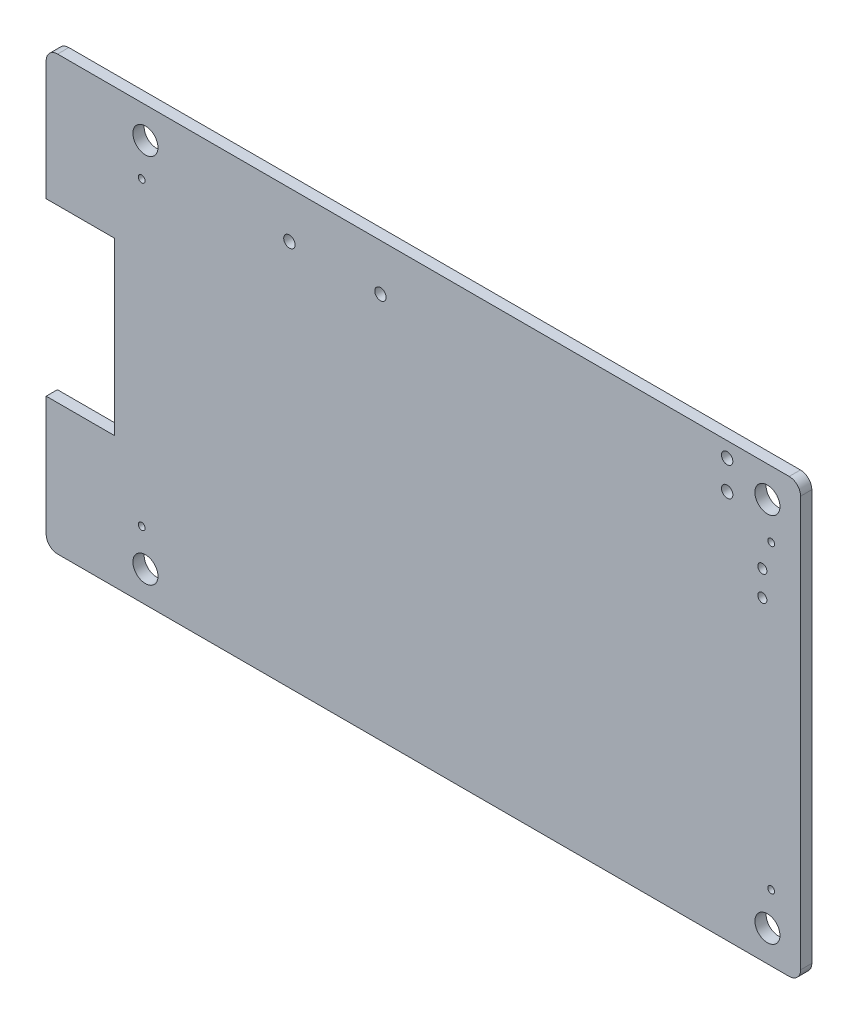
ISO-10303-21;
HEADER;
FILE_DESCRIPTION(('STEP AP214'),'2;1');
FILE_NAME('part.step','',(''),(''),'','','');
FILE_SCHEMA(('AUTOMOTIVE_DESIGN { 1 0 10303 214 1 1 1 1 }'));
ENDSEC;
DATA;
#1=APPLICATION_CONTEXT('core data for automotive mechanical design processes');
#2=APPLICATION_PROTOCOL_DEFINITION('international standard','automotive_design',2000,#1);
#3=PRODUCT_CONTEXT('',#1,'mechanical');
#4=PRODUCT('Part','Part','',(#3));
#5=PRODUCT_RELATED_PRODUCT_CATEGORY('part','',(#4));
#6=PRODUCT_DEFINITION_FORMATION('','',#4);
#7=PRODUCT_DEFINITION_CONTEXT('part definition',#1,'design');
#8=PRODUCT_DEFINITION('design','',#6,#7);
#9=PRODUCT_DEFINITION_SHAPE('','',#8);
#10=(LENGTH_UNIT() NAMED_UNIT(*) SI_UNIT(.MILLI.,.METRE.));
#11=(NAMED_UNIT(*) PLANE_ANGLE_UNIT() SI_UNIT($,.RADIAN.));
#12=(NAMED_UNIT(*) SI_UNIT($,.STERADIAN.) SOLID_ANGLE_UNIT());
#13=UNCERTAINTY_MEASURE_WITH_UNIT(LENGTH_MEASURE(1.E-05),#10,'distance_accuracy_value','');
#14=(GEOMETRIC_REPRESENTATION_CONTEXT(3) GLOBAL_UNCERTAINTY_ASSIGNED_CONTEXT((#13)) GLOBAL_UNIT_ASSIGNED_CONTEXT((#10,
#11,#12)) REPRESENTATION_CONTEXT('',''));
#15=CARTESIAN_POINT('',(0.,0.,0.));
#16=DIRECTION('',(0.,0.,1.));
#17=DIRECTION('',(1.,0.,0.));
#18=AXIS2_PLACEMENT_3D('',#15,#16,#17);
#19=CARTESIAN_POINT('',(-36.,-18.,0.));
#20=DIRECTION('',(-1.,0.,0.));
#21=DIRECTION('',(0.,1.,0.));
#22=AXIS2_PLACEMENT_3D('',#19,#20,#21);
#23=PLANE('',#22);
#24=DIRECTION('',(0.,0.,1.));
#25=VECTOR('',#24,1.);
#26=CARTESIAN_POINT('',(-36.,-18.,0.));
#27=LINE('',#26,#25);
#28=CARTESIAN_POINT('',(-36.,-18.,0.));
#29=VERTEX_POINT('',#28);
#30=CARTESIAN_POINT('',(-36.,-18.,0.98552));
#31=VERTEX_POINT('',#30);
#32=EDGE_CURVE('E11',#29,#31,#27,.T.);
#33=ORIENTED_EDGE('',*,*,#32,.T.);
#34=DIRECTION('',(0.,1.,0.));
#35=VECTOR('',#34,1.);
#36=CARTESIAN_POINT('',(-36.,-18.,0.98552));
#37=LINE('',#36,#35);
#38=CARTESIAN_POINT('',(-36.,-7.5,0.98552));
#39=VERTEX_POINT('',#38);
#40=EDGE_CURVE('E24',#31,#39,#37,.T.);
#41=ORIENTED_EDGE('',*,*,#40,.T.);
#42=DIRECTION('',(0.,0.,1.));
#43=VECTOR('',#42,1.);
#44=CARTESIAN_POINT('',(-36.,-7.5,0.));
#45=LINE('',#44,#43);
#46=CARTESIAN_POINT('',(-36.,-7.5,0.));
#47=VERTEX_POINT('',#46);
#48=EDGE_CURVE('E387',#47,#39,#45,.T.);
#49=ORIENTED_EDGE('',*,*,#48,.F.);
#50=DIRECTION('',(0.,1.,0.));
#51=VECTOR('',#50,1.);
#52=CARTESIAN_POINT('',(-36.,-18.,0.));
#53=LINE('',#52,#51);
#54=EDGE_CURVE('E384',#29,#47,#53,.T.);
#55=ORIENTED_EDGE('',*,*,#54,.F.);
#56=EDGE_LOOP('',(#33,#41,#49,#55));
#57=FACE_BOUND('',#56,.T.);
#58=ADVANCED_FACE('F17',(#57),#23,.T.);
#59=CARTESIAN_POINT('',(-36.,-7.5,0.));
#60=DIRECTION('',(0.,1.,0.));
#61=DIRECTION('',(1.,0.,0.));
#62=AXIS2_PLACEMENT_3D('',#59,#60,#61);
#63=PLANE('',#62);
#64=ORIENTED_EDGE('',*,*,#48,.T.);
#65=DIRECTION('',(1.,0.,0.));
#66=VECTOR('',#65,1.);
#67=CARTESIAN_POINT('',(-36.,-7.5,0.98552));
#68=LINE('',#67,#66);
#69=CARTESIAN_POINT('',(-30.,-7.5,0.98552));
#70=VERTEX_POINT('',#69);
#71=EDGE_CURVE('E381',#39,#70,#68,.T.);
#72=ORIENTED_EDGE('',*,*,#71,.T.);
#73=DIRECTION('',(0.,0.,1.));
#74=VECTOR('',#73,1.);
#75=CARTESIAN_POINT('',(-30.,-7.5,0.));
#76=LINE('',#75,#74);
#77=CARTESIAN_POINT('',(-30.,-7.5,0.));
#78=VERTEX_POINT('',#77);
#79=EDGE_CURVE('E379',#78,#70,#76,.T.);
#80=ORIENTED_EDGE('',*,*,#79,.F.);
#81=DIRECTION('',(1.,0.,0.));
#82=VECTOR('',#81,1.);
#83=CARTESIAN_POINT('',(-36.,-7.5,0.));
#84=LINE('',#83,#82);
#85=EDGE_CURVE('E376',#47,#78,#84,.T.);
#86=ORIENTED_EDGE('',*,*,#85,.F.);
#87=EDGE_LOOP('',(#64,#72,#80,#86));
#88=FACE_BOUND('',#87,.T.);
#89=ADVANCED_FACE('F396',(#88),#63,.T.);
#90=CARTESIAN_POINT('',(-30.,-7.5,0.));
#91=DIRECTION('',(-1.,0.,0.));
#92=DIRECTION('',(0.,1.,0.));
#93=AXIS2_PLACEMENT_3D('',#90,#91,#92);
#94=PLANE('',#93);
#95=ORIENTED_EDGE('',*,*,#79,.T.);
#96=DIRECTION('',(0.,1.,0.));
#97=VECTOR('',#96,1.);
#98=CARTESIAN_POINT('',(-30.,-7.5,0.98552));
#99=LINE('',#98,#97);
#100=CARTESIAN_POINT('',(-30.,7.5,0.98552));
#101=VERTEX_POINT('',#100);
#102=EDGE_CURVE('E373',#70,#101,#99,.T.);
#103=ORIENTED_EDGE('',*,*,#102,.T.);
#104=DIRECTION('',(0.,0.,1.));
#105=VECTOR('',#104,1.);
#106=CARTESIAN_POINT('',(-30.,7.5,0.));
#107=LINE('',#106,#105);
#108=CARTESIAN_POINT('',(-30.,7.5,0.));
#109=VERTEX_POINT('',#108);
#110=EDGE_CURVE('E371',#109,#101,#107,.T.);
#111=ORIENTED_EDGE('',*,*,#110,.F.);
#112=DIRECTION('',(0.,1.,0.));
#113=VECTOR('',#112,1.);
#114=CARTESIAN_POINT('',(-30.,-7.5,0.));
#115=LINE('',#114,#113);
#116=EDGE_CURVE('E368',#78,#109,#115,.T.);
#117=ORIENTED_EDGE('',*,*,#116,.F.);
#118=EDGE_LOOP('',(#95,#103,#111,#117));
#119=FACE_BOUND('',#118,.T.);
#120=ADVANCED_FACE('F403',(#119),#94,.T.);
#121=CARTESIAN_POINT('',(-30.,7.5,0.));
#122=DIRECTION('',(0.,-1.,0.));
#123=DIRECTION('',(-1.,0.,0.));
#124=AXIS2_PLACEMENT_3D('',#121,#122,#123);
#125=PLANE('',#124);
#126=ORIENTED_EDGE('',*,*,#110,.T.);
#127=DIRECTION('',(-1.,0.,0.));
#128=VECTOR('',#127,1.);
#129=CARTESIAN_POINT('',(-30.,7.5,0.98552));
#130=LINE('',#129,#128);
#131=CARTESIAN_POINT('',(-36.,7.5,0.98552));
#132=VERTEX_POINT('',#131);
#133=EDGE_CURVE('E365',#101,#132,#130,.T.);
#134=ORIENTED_EDGE('',*,*,#133,.T.);
#135=DIRECTION('',(0.,0.,1.));
#136=VECTOR('',#135,1.);
#137=CARTESIAN_POINT('',(-36.,7.5,0.));
#138=LINE('',#137,#136);
#139=CARTESIAN_POINT('',(-36.,7.5,0.));
#140=VERTEX_POINT('',#139);
#141=EDGE_CURVE('E363',#140,#132,#138,.T.);
#142=ORIENTED_EDGE('',*,*,#141,.F.);
#143=DIRECTION('',(-1.,0.,0.));
#144=VECTOR('',#143,1.);
#145=CARTESIAN_POINT('',(-30.,7.5,0.));
#146=LINE('',#145,#144);
#147=EDGE_CURVE('E360',#109,#140,#146,.T.);
#148=ORIENTED_EDGE('',*,*,#147,.F.);
#149=EDGE_LOOP('',(#126,#134,#142,#148));
#150=FACE_BOUND('',#149,.T.);
#151=ADVANCED_FACE('F405',(#150),#125,.T.);
#152=CARTESIAN_POINT('',(-36.,7.5,0.));
#153=DIRECTION('',(-1.,0.,0.));
#154=DIRECTION('',(0.,1.,0.));
#155=AXIS2_PLACEMENT_3D('',#152,#153,#154);
#156=PLANE('',#155);
#157=ORIENTED_EDGE('',*,*,#141,.T.);
#158=DIRECTION('',(0.,1.,0.));
#159=VECTOR('',#158,1.);
#160=CARTESIAN_POINT('',(-36.,7.5,0.98552));
#161=LINE('',#160,#159);
#162=CARTESIAN_POINT('',(-36.,18.,0.98552));
#163=VERTEX_POINT('',#162);
#164=EDGE_CURVE('E358',#132,#163,#161,.T.);
#165=ORIENTED_EDGE('',*,*,#164,.T.);
#166=DIRECTION('',(0.,0.,1.));
#167=VECTOR('',#166,1.);
#168=CARTESIAN_POINT('',(-36.,18.,0.));
#169=LINE('',#168,#167);
#170=CARTESIAN_POINT('',(-36.,18.,0.));
#171=VERTEX_POINT('',#170);
#172=EDGE_CURVE('E355',#171,#163,#169,.T.);
#173=ORIENTED_EDGE('',*,*,#172,.F.);
#174=DIRECTION('',(0.,1.,0.));
#175=VECTOR('',#174,1.);
#176=CARTESIAN_POINT('',(-36.,7.5,0.));
#177=LINE('',#176,#175);
#178=EDGE_CURVE('E353',#140,#171,#177,.T.);
#179=ORIENTED_EDGE('',*,*,#178,.F.);
#180=EDGE_LOOP('',(#157,#165,#173,#179));
#181=FACE_BOUND('',#180,.T.);
#182=ADVANCED_FACE('F414',(#181),#156,.T.);
#183=CARTESIAN_POINT('',(-34.9996377685403,17.9996377685403,0.));
#184=DIRECTION('',(0.,0.,-1.));
#185=DIRECTION('',(-0.999999934441694,0.000362100271853611,0.));
#186=AXIS2_PLACEMENT_3D('',#183,#184,#185);
#187=CYLINDRICAL_SURFACE('',#186,1.00036229704177);
#188=ORIENTED_EDGE('',*,*,#172,.T.);
#189=CARTESIAN_POINT('',(-34.9996377685403,17.9996377685403,0.98552));
#190=DIRECTION('',(0.,0.,-1.));
#191=DIRECTION('',(-0.999999934441694,0.000362100271853611,0.));
#192=AXIS2_PLACEMENT_3D('',#189,#190,#191);
#193=CIRCLE('',#192,1.00036229704177);
#194=CARTESIAN_POINT('',(-35.,19.,0.98552));
#195=VERTEX_POINT('',#194);
#196=EDGE_CURVE('E350',#163,#195,#193,.T.);
#197=ORIENTED_EDGE('',*,*,#196,.T.);
#198=DIRECTION('',(0.,0.,1.));
#199=VECTOR('',#198,1.);
#200=CARTESIAN_POINT('',(-35.,19.,0.));
#201=LINE('',#200,#199);
#202=CARTESIAN_POINT('',(-35.,19.,0.));
#203=VERTEX_POINT('',#202);
#204=EDGE_CURVE('E347',#203,#195,#201,.T.);
#205=ORIENTED_EDGE('',*,*,#204,.F.);
#206=CARTESIAN_POINT('',(-34.9996377685403,17.9996377685403,0.));
#207=DIRECTION('',(0.,0.,-1.));
#208=DIRECTION('',(-0.999999934441694,0.000362100271853611,0.));
#209=AXIS2_PLACEMENT_3D('',#206,#207,#208);
#210=CIRCLE('',#209,1.00036229704177);
#211=EDGE_CURVE('E344',#171,#203,#210,.T.);
#212=ORIENTED_EDGE('',*,*,#211,.F.);
#213=EDGE_LOOP('',(#188,#197,#205,#212));
#214=FACE_BOUND('',#213,.T.);
#215=ADVANCED_FACE('F412',(#214),#187,.T.);
#216=CARTESIAN_POINT('',(-35.,19.,0.));
#217=DIRECTION('',(0.,1.,0.));
#218=DIRECTION('',(1.,0.,0.));
#219=AXIS2_PLACEMENT_3D('',#216,#217,#218);
#220=PLANE('',#219);
#221=ORIENTED_EDGE('',*,*,#204,.T.);
#222=DIRECTION('',(1.,0.,0.));
#223=VECTOR('',#222,1.);
#224=CARTESIAN_POINT('',(-35.,19.,0.98552));
#225=LINE('',#224,#223);
#226=CARTESIAN_POINT('',(29.2000007629394,19.,0.98552));
#227=VERTEX_POINT('',#226);
#228=EDGE_CURVE('E341',#195,#227,#225,.T.);
#229=ORIENTED_EDGE('',*,*,#228,.T.);
#230=DIRECTION('',(0.,0.,1.));
#231=VECTOR('',#230,1.);
#232=CARTESIAN_POINT('',(29.2000007629394,19.,0.));
#233=LINE('',#232,#231);
#234=CARTESIAN_POINT('',(29.2000007629394,19.,0.));
#235=VERTEX_POINT('',#234);
#236=EDGE_CURVE('E339',#235,#227,#233,.T.);
#237=ORIENTED_EDGE('',*,*,#236,.F.);
#238=DIRECTION('',(1.,0.,0.));
#239=VECTOR('',#238,1.);
#240=CARTESIAN_POINT('',(-35.,19.,0.));
#241=LINE('',#240,#239);
#242=EDGE_CURVE('E336',#203,#235,#241,.T.);
#243=ORIENTED_EDGE('',*,*,#242,.F.);
#244=EDGE_LOOP('',(#221,#229,#237,#243));
#245=FACE_BOUND('',#244,.T.);
#246=ADVANCED_FACE('F419',(#245),#220,.T.);
#247=CARTESIAN_POINT('',(29.199635272573,17.9996345096335,0.));
#248=DIRECTION('',(0.,0.,-1.));
#249=DIRECTION('',(0.000365356807696419,0.999999933257199,0.));
#250=AXIS2_PLACEMENT_3D('',#247,#248,#249);
#251=CYLINDRICAL_SURFACE('',#250,1.00036555713368);
#252=ORIENTED_EDGE('',*,*,#236,.T.);
#253=CARTESIAN_POINT('',(29.199635272573,17.9996345096335,0.98552));
#254=DIRECTION('',(0.,0.,-1.));
#255=DIRECTION('',(0.000365356807696419,0.999999933257199,0.));
#256=AXIS2_PLACEMENT_3D('',#253,#254,#255);
#257=CIRCLE('',#256,1.00036555713368);
#258=CARTESIAN_POINT('',(30.2000007629394,18.,0.98552));
#259=VERTEX_POINT('',#258);
#260=EDGE_CURVE('E334',#227,#259,#257,.T.);
#261=ORIENTED_EDGE('',*,*,#260,.T.);
#262=DIRECTION('',(0.,0.,1.));
#263=VECTOR('',#262,1.);
#264=CARTESIAN_POINT('',(30.2000007629394,18.,0.));
#265=LINE('',#264,#263);
#266=CARTESIAN_POINT('',(30.2000007629394,18.,0.));
#267=VERTEX_POINT('',#266);
#268=EDGE_CURVE('E331',#267,#259,#265,.T.);
#269=ORIENTED_EDGE('',*,*,#268,.F.);
#270=CARTESIAN_POINT('',(29.199635272573,17.9996345096335,0.));
#271=DIRECTION('',(0.,0.,-1.));
#272=DIRECTION('',(0.000365356807696419,0.999999933257199,0.));
#273=AXIS2_PLACEMENT_3D('',#270,#271,#272);
#274=CIRCLE('',#273,1.00036555713368);
#275=EDGE_CURVE('E328',#235,#267,#274,.T.);
#276=ORIENTED_EDGE('',*,*,#275,.F.);
#277=EDGE_LOOP('',(#252,#261,#269,#276));
#278=FACE_BOUND('',#277,.T.);
#279=ADVANCED_FACE('F423',(#278),#251,.T.);
#280=CARTESIAN_POINT('',(30.2000007629394,18.,0.));
#281=DIRECTION('',(1.,0.,0.));
#282=DIRECTION('',(0.,-1.,0.));
#283=AXIS2_PLACEMENT_3D('',#280,#281,#282);
#284=PLANE('',#283);
#285=ORIENTED_EDGE('',*,*,#268,.T.);
#286=DIRECTION('',(0.,-1.,0.));
#287=VECTOR('',#286,1.);
#288=CARTESIAN_POINT('',(30.2000007629394,18.,0.98552));
#289=LINE('',#288,#287);
#290=CARTESIAN_POINT('',(30.2000007629394,-18.,0.98552));
#291=VERTEX_POINT('',#290);
#292=EDGE_CURVE('E325',#259,#291,#289,.T.);
#293=ORIENTED_EDGE('',*,*,#292,.T.);
#294=DIRECTION('',(0.,0.,1.));
#295=VECTOR('',#294,1.);
#296=CARTESIAN_POINT('',(30.2000007629394,-18.,0.));
#297=LINE('',#296,#295);
#298=CARTESIAN_POINT('',(30.2000007629394,-18.,0.));
#299=VERTEX_POINT('',#298);
#300=EDGE_CURVE('E322',#299,#291,#297,.T.);
#301=ORIENTED_EDGE('',*,*,#300,.F.);
#302=DIRECTION('',(0.,-1.,0.));
#303=VECTOR('',#302,1.);
#304=CARTESIAN_POINT('',(30.2000007629394,18.,0.));
#305=LINE('',#304,#303);
#306=EDGE_CURVE('E319',#267,#299,#305,.T.);
#307=ORIENTED_EDGE('',*,*,#306,.F.);
#308=EDGE_LOOP('',(#285,#293,#301,#307));
#309=FACE_BOUND('',#308,.T.);
#310=ADVANCED_FACE('F425',(#309),#284,.T.);
#311=CARTESIAN_POINT('',(29.199635272573,-17.9996345096335,0.));
#312=DIRECTION('',(0.,0.,-1.));
#313=DIRECTION('',(0.999999933257199,-0.000365356807696419,0.));
#314=AXIS2_PLACEMENT_3D('',#311,#312,#313);
#315=CYLINDRICAL_SURFACE('',#314,1.00036555713368);
#316=ORIENTED_EDGE('',*,*,#300,.T.);
#317=CARTESIAN_POINT('',(29.199635272573,-17.9996345096335,0.98552));
#318=DIRECTION('',(0.,0.,-1.));
#319=DIRECTION('',(0.999999933257199,-0.000365356807696419,0.));
#320=AXIS2_PLACEMENT_3D('',#317,#318,#319);
#321=CIRCLE('',#320,1.00036555713368);
#322=CARTESIAN_POINT('',(29.2000007629394,-19.,0.98552));
#323=VERTEX_POINT('',#322);
#324=EDGE_CURVE('E317',#291,#323,#321,.T.);
#325=ORIENTED_EDGE('',*,*,#324,.T.);
#326=DIRECTION('',(0.,0.,1.));
#327=VECTOR('',#326,1.);
#328=CARTESIAN_POINT('',(29.2000007629394,-19.,0.));
#329=LINE('',#328,#327);
#330=CARTESIAN_POINT('',(29.2000007629394,-19.,0.));
#331=VERTEX_POINT('',#330);
#332=EDGE_CURVE('E314',#331,#323,#329,.T.);
#333=ORIENTED_EDGE('',*,*,#332,.F.);
#334=CARTESIAN_POINT('',(29.199635272573,-17.9996345096335,0.));
#335=DIRECTION('',(0.,0.,-1.));
#336=DIRECTION('',(0.999999933257199,-0.000365356807696419,0.));
#337=AXIS2_PLACEMENT_3D('',#334,#335,#336);
#338=CIRCLE('',#337,1.00036555713368);
#339=EDGE_CURVE('E312',#299,#331,#338,.T.);
#340=ORIENTED_EDGE('',*,*,#339,.F.);
#341=EDGE_LOOP('',(#316,#325,#333,#340));
#342=FACE_BOUND('',#341,.T.);
#343=ADVANCED_FACE('F430',(#342),#315,.T.);
#344=CARTESIAN_POINT('',(29.2000007629395,-19.,0.));
#345=DIRECTION('',(0.,-1.,0.));
#346=DIRECTION('',(-1.,0.,0.));
#347=AXIS2_PLACEMENT_3D('',#344,#345,#346);
#348=PLANE('',#347);
#349=ORIENTED_EDGE('',*,*,#332,.T.);
#350=DIRECTION('',(-1.,0.,0.));
#351=VECTOR('',#350,1.);
#352=CARTESIAN_POINT('',(29.2000007629394,-19.,0.98552));
#353=LINE('',#352,#351);
#354=CARTESIAN_POINT('',(-35.,-19.,0.98552));
#355=VERTEX_POINT('',#354);
#356=EDGE_CURVE('E309',#323,#355,#353,.T.);
#357=ORIENTED_EDGE('',*,*,#356,.T.);
#358=DIRECTION('',(0.,0.,1.));
#359=VECTOR('',#358,1.);
#360=CARTESIAN_POINT('',(-35.,-19.,0.));
#361=LINE('',#360,#359);
#362=CARTESIAN_POINT('',(-35.,-19.,0.));
#363=VERTEX_POINT('',#362);
#364=EDGE_CURVE('E307',#363,#355,#361,.T.);
#365=ORIENTED_EDGE('',*,*,#364,.F.);
#366=DIRECTION('',(-1.,0.,0.));
#367=VECTOR('',#366,1.);
#368=CARTESIAN_POINT('',(29.2000007629394,-19.,0.));
#369=LINE('',#368,#367);
#370=EDGE_CURVE('E304',#331,#363,#369,.T.);
#371=ORIENTED_EDGE('',*,*,#370,.F.);
#372=EDGE_LOOP('',(#349,#357,#365,#371));
#373=FACE_BOUND('',#372,.T.);
#374=ADVANCED_FACE('F434',(#373),#348,.T.);
#375=CARTESIAN_POINT('',(-34.9996377685403,-17.9996377685403,0.));
#376=DIRECTION('',(0.,0.,-1.));
#377=DIRECTION('',(-0.000362100271853611,-0.999999934441694,0.));
#378=AXIS2_PLACEMENT_3D('',#375,#376,#377);
#379=CYLINDRICAL_SURFACE('',#378,1.00036229704177);
#380=ORIENTED_EDGE('',*,*,#364,.T.);
#381=CARTESIAN_POINT('',(-34.9996377685403,-17.9996377685403,0.98552));
#382=DIRECTION('',(0.,0.,-1.));
#383=DIRECTION('',(-0.000362100271853611,-0.999999934441694,0.));
#384=AXIS2_PLACEMENT_3D('',#381,#382,#383);
#385=CIRCLE('',#384,1.00036229704177);
#386=EDGE_CURVE('E302',#355,#31,#385,.T.);
#387=ORIENTED_EDGE('',*,*,#386,.T.);
#388=ORIENTED_EDGE('',*,*,#32,.F.);
#389=CARTESIAN_POINT('',(-34.9996377685403,-17.9996377685403,0.));
#390=DIRECTION('',(0.,0.,-1.));
#391=DIRECTION('',(-0.000362100271853611,-0.999999934441694,0.));
#392=AXIS2_PLACEMENT_3D('',#389,#390,#391);
#393=CIRCLE('',#392,1.00036229704177);
#394=EDGE_CURVE('E299',#363,#29,#393,.T.);
#395=ORIENTED_EDGE('',*,*,#394,.F.);
#396=EDGE_LOOP('',(#380,#387,#388,#395));
#397=FACE_BOUND('',#396,.T.);
#398=ADVANCED_FACE('F435',(#397),#379,.T.);
#399=CARTESIAN_POINT('',(-27.62000064,13.1999990000001,0.));
#400=DIRECTION('',(0.,0.,-1.));
#401=DIRECTION('',(1.,0.,0.));
#402=AXIS2_PLACEMENT_3D('',#399,#400,#401);
#403=CYLINDRICAL_SURFACE('',#402,0.2999994);
#404=DIRECTION('',(0.,0.,1.));
#405=VECTOR('',#404,1.);
#406=CARTESIAN_POINT('',(-27.32000124,13.1999990000001,0.));
#407=LINE('',#406,#405);
#408=CARTESIAN_POINT('',(-27.32000124,13.1999990000001,0.));
#409=VERTEX_POINT('',#408);
#410=CARTESIAN_POINT('',(-27.32000124,13.1999990000001,0.98552));
#411=VERTEX_POINT('',#410);
#412=EDGE_CURVE('E297',#409,#411,#407,.T.);
#413=ORIENTED_EDGE('',*,*,#412,.T.);
#414=CARTESIAN_POINT('',(-27.62000064,13.1999990000001,0.98552));
#415=DIRECTION('',(0.,0.,1.));
#416=DIRECTION('',(1.,0.,0.));
#417=AXIS2_PLACEMENT_3D('',#414,#415,#416);
#418=CIRCLE('',#417,0.2999994);
#419=EDGE_CURVE('E294',#411,#411,#418,.T.);
#420=ORIENTED_EDGE('',*,*,#419,.T.);
#421=ORIENTED_EDGE('',*,*,#412,.F.);
#422=CARTESIAN_POINT('',(-27.62000064,13.1999990000001,0.));
#423=DIRECTION('',(0.,0.,1.));
#424=DIRECTION('',(1.,0.,0.));
#425=AXIS2_PLACEMENT_3D('',#422,#423,#424);
#426=CIRCLE('',#425,0.2999994);
#427=EDGE_CURVE('E291',#409,#409,#426,.T.);
#428=ORIENTED_EDGE('',*,*,#427,.F.);
#429=EDGE_LOOP('',(#413,#420,#421,#428));
#430=FACE_BOUND('',#429,.T.);
#431=ADVANCED_FACE('F437',(#430),#403,.F.);
#432=CARTESIAN_POINT('',(-27.28999876,-16.29000044,0.));
#433=DIRECTION('',(0.,0.,-1.));
#434=DIRECTION('',(1.,0.,0.));
#435=AXIS2_PLACEMENT_3D('',#432,#433,#434);
#436=CYLINDRICAL_SURFACE('',#435,1.10000034);
#437=DIRECTION('',(0.,0.,1.));
#438=VECTOR('',#437,1.);
#439=CARTESIAN_POINT('',(-26.18999842,-16.29000044,0.));
#440=LINE('',#439,#438);
#441=CARTESIAN_POINT('',(-26.18999842,-16.29000044,0.));
#442=VERTEX_POINT('',#441);
#443=CARTESIAN_POINT('',(-26.18999842,-16.29000044,0.98552));
#444=VERTEX_POINT('',#443);
#445=EDGE_CURVE('E289',#442,#444,#440,.T.);
#446=ORIENTED_EDGE('',*,*,#445,.T.);
#447=CARTESIAN_POINT('',(-27.28999876,-16.29000044,0.98552));
#448=DIRECTION('',(0.,0.,1.));
#449=DIRECTION('',(1.,0.,0.));
#450=AXIS2_PLACEMENT_3D('',#447,#448,#449);
#451=CIRCLE('',#450,1.10000034);
#452=EDGE_CURVE('E286',#444,#444,#451,.T.);
#453=ORIENTED_EDGE('',*,*,#452,.T.);
#454=ORIENTED_EDGE('',*,*,#445,.F.);
#455=CARTESIAN_POINT('',(-27.28999876,-16.29000044,0.));
#456=DIRECTION('',(0.,0.,1.));
#457=DIRECTION('',(1.,0.,0.));
#458=AXIS2_PLACEMENT_3D('',#455,#456,#457);
#459=CIRCLE('',#458,1.10000034);
#460=EDGE_CURVE('E283',#442,#442,#459,.T.);
#461=ORIENTED_EDGE('',*,*,#460,.F.);
#462=EDGE_LOOP('',(#446,#453,#454,#461));
#463=FACE_BOUND('',#462,.T.);
#464=ADVANCED_FACE('F444',(#463),#436,.F.);
#465=CARTESIAN_POINT('',(-27.62000064,-13.1999989999999,0.));
#466=DIRECTION('',(0.,0.,-1.));
#467=DIRECTION('',(1.,0.,0.));
#468=AXIS2_PLACEMENT_3D('',#465,#466,#467);
#469=CYLINDRICAL_SURFACE('',#468,0.2999994);
#470=DIRECTION('',(0.,0.,1.));
#471=VECTOR('',#470,1.);
#472=CARTESIAN_POINT('',(-27.32000124,-13.1999989999999,0.));
#473=LINE('',#472,#471);
#474=CARTESIAN_POINT('',(-27.32000124,-13.1999989999999,0.));
#475=VERTEX_POINT('',#474);
#476=CARTESIAN_POINT('',(-27.32000124,-13.1999989999999,0.98552));
#477=VERTEX_POINT('',#476);
#478=EDGE_CURVE('E281',#475,#477,#473,.T.);
#479=ORIENTED_EDGE('',*,*,#478,.T.);
#480=CARTESIAN_POINT('',(-27.62000064,-13.1999989999999,0.98552));
#481=DIRECTION('',(0.,0.,1.));
#482=DIRECTION('',(1.,0.,0.));
#483=AXIS2_PLACEMENT_3D('',#480,#481,#482);
#484=CIRCLE('',#483,0.2999994);
#485=EDGE_CURVE('E278',#477,#477,#484,.T.);
#486=ORIENTED_EDGE('',*,*,#485,.T.);
#487=ORIENTED_EDGE('',*,*,#478,.F.);
#488=CARTESIAN_POINT('',(-27.62000064,-13.1999989999999,0.));
#489=DIRECTION('',(0.,0.,1.));
#490=DIRECTION('',(1.,0.,0.));
#491=AXIS2_PLACEMENT_3D('',#488,#489,#490);
#492=CIRCLE('',#491,0.2999994);
#493=EDGE_CURVE('E275',#475,#475,#492,.T.);
#494=ORIENTED_EDGE('',*,*,#493,.F.);
#495=EDGE_LOOP('',(#479,#486,#487,#494));
#496=FACE_BOUND('',#495,.T.);
#497=ADVANCED_FACE('F505',(#496),#469,.F.);
#498=CARTESIAN_POINT('',(-14.65628514,14.9244405600001,0.));
#499=DIRECTION('',(0.,0.,-1.));
#500=DIRECTION('',(1.,0.,0.));
#501=AXIS2_PLACEMENT_3D('',#498,#499,#500);
#502=CYLINDRICAL_SURFACE('',#501,0.499999);
#503=DIRECTION('',(0.,0.,1.));
#504=VECTOR('',#503,1.);
#505=CARTESIAN_POINT('',(-14.15628614,14.9244405600001,0.));
#506=LINE('',#505,#504);
#507=CARTESIAN_POINT('',(-14.15628614,14.9244405600001,0.));
#508=VERTEX_POINT('',#507);
#509=CARTESIAN_POINT('',(-14.15628614,14.9244405600001,0.98552));
#510=VERTEX_POINT('',#509);
#511=EDGE_CURVE('E273',#508,#510,#506,.T.);
#512=ORIENTED_EDGE('',*,*,#511,.T.);
#513=CARTESIAN_POINT('',(-14.65628514,14.9244405600001,0.98552));
#514=DIRECTION('',(0.,0.,1.));
#515=DIRECTION('',(1.,0.,0.));
#516=AXIS2_PLACEMENT_3D('',#513,#514,#515);
#517=CIRCLE('',#516,0.499999);
#518=EDGE_CURVE('E270',#510,#510,#517,.T.);
#519=ORIENTED_EDGE('',*,*,#518,.T.);
#520=ORIENTED_EDGE('',*,*,#511,.F.);
#521=CARTESIAN_POINT('',(-14.65628514,14.9244405600001,0.));
#522=DIRECTION('',(0.,0.,1.));
#523=DIRECTION('',(1.,0.,0.));
#524=AXIS2_PLACEMENT_3D('',#521,#522,#523);
#525=CIRCLE('',#524,0.499999);
#526=EDGE_CURVE('E267',#508,#508,#525,.T.);
#527=ORIENTED_EDGE('',*,*,#526,.F.);
#528=EDGE_LOOP('',(#512,#519,#520,#527));
#529=FACE_BOUND('',#528,.T.);
#530=ADVANCED_FACE('F515',(#529),#502,.F.);
#531=CARTESIAN_POINT('',(-27.28999876,16.29000044,0.));
#532=DIRECTION('',(0.,0.,-1.));
#533=DIRECTION('',(1.,0.,0.));
#534=AXIS2_PLACEMENT_3D('',#531,#532,#533);
#535=CYLINDRICAL_SURFACE('',#534,1.10000034);
#536=DIRECTION('',(0.,0.,1.));
#537=VECTOR('',#536,1.);
#538=CARTESIAN_POINT('',(-26.18999842,16.29000044,0.));
#539=LINE('',#538,#537);
#540=CARTESIAN_POINT('',(-26.18999842,16.29000044,0.));
#541=VERTEX_POINT('',#540);
#542=CARTESIAN_POINT('',(-26.18999842,16.29000044,0.98552));
#543=VERTEX_POINT('',#542);
#544=EDGE_CURVE('E265',#541,#543,#539,.T.);
#545=ORIENTED_EDGE('',*,*,#544,.T.);
#546=CARTESIAN_POINT('',(-27.28999876,16.29000044,0.98552));
#547=DIRECTION('',(0.,0.,1.));
#548=DIRECTION('',(1.,0.,0.));
#549=AXIS2_PLACEMENT_3D('',#546,#547,#548);
#550=CIRCLE('',#549,1.10000034);
#551=EDGE_CURVE('E262',#543,#543,#550,.T.);
#552=ORIENTED_EDGE('',*,*,#551,.T.);
#553=ORIENTED_EDGE('',*,*,#544,.F.);
#554=CARTESIAN_POINT('',(-27.28999876,16.29000044,0.));
#555=DIRECTION('',(0.,0.,1.));
#556=DIRECTION('',(1.,0.,0.));
#557=AXIS2_PLACEMENT_3D('',#554,#555,#556);
#558=CIRCLE('',#557,1.10000034);
#559=EDGE_CURVE('E259',#541,#541,#558,.T.);
#560=ORIENTED_EDGE('',*,*,#559,.F.);
#561=EDGE_LOOP('',(#545,#552,#553,#560));
#562=FACE_BOUND('',#561,.T.);
#563=ADVANCED_FACE('F525',(#562),#535,.F.);
#564=CARTESIAN_POINT('',(-6.66761430000003,14.9207728,0.));
#565=DIRECTION('',(0.,0.,-1.));
#566=DIRECTION('',(1.,0.,0.));
#567=AXIS2_PLACEMENT_3D('',#564,#565,#566);
#568=CYLINDRICAL_SURFACE('',#567,0.499999);
#569=DIRECTION('',(0.,0.,1.));
#570=VECTOR('',#569,1.);
#571=CARTESIAN_POINT('',(-6.16761530000003,14.9207728,0.));
#572=LINE('',#571,#570);
#573=CARTESIAN_POINT('',(-6.16761530000003,14.9207728,0.));
#574=VERTEX_POINT('',#573);
#575=CARTESIAN_POINT('',(-6.16761530000003,14.9207728,0.98552));
#576=VERTEX_POINT('',#575);
#577=EDGE_CURVE('E256',#574,#576,#572,.T.);
#578=ORIENTED_EDGE('',*,*,#577,.T.);
#579=CARTESIAN_POINT('',(-6.66761430000003,14.9207728,0.98552));
#580=DIRECTION('',(0.,0.,1.));
#581=DIRECTION('',(1.,0.,0.));
#582=AXIS2_PLACEMENT_3D('',#579,#580,#581);
#583=CIRCLE('',#582,0.499999);
#584=EDGE_CURVE('E254',#576,#576,#583,.T.);
#585=ORIENTED_EDGE('',*,*,#584,.T.);
#586=ORIENTED_EDGE('',*,*,#577,.F.);
#587=CARTESIAN_POINT('',(-6.66761430000003,14.9207728,0.));
#588=DIRECTION('',(0.,0.,1.));
#589=DIRECTION('',(1.,0.,0.));
#590=AXIS2_PLACEMENT_3D('',#587,#588,#589);
#591=CIRCLE('',#590,0.499999);
#592=EDGE_CURVE('E252',#574,#574,#591,.T.);
#593=ORIENTED_EDGE('',*,*,#592,.F.);
#594=EDGE_LOOP('',(#578,#585,#586,#593));
#595=FACE_BOUND('',#594,.T.);
#596=ADVANCED_FACE('F535',(#595),#568,.F.);
#597=CARTESIAN_POINT('',(23.75582498,15.12569238,0.));
#598=DIRECTION('',(0.,0.,-1.));
#599=DIRECTION('',(1.,0.,0.));
#600=AXIS2_PLACEMENT_3D('',#597,#598,#599);
#601=CYLINDRICAL_SURFACE('',#600,0.499999);
#602=DIRECTION('',(0.,0.,1.));
#603=VECTOR('',#602,1.);
#604=CARTESIAN_POINT('',(24.25582398,15.12569238,0.));
#605=LINE('',#604,#603);
#606=CARTESIAN_POINT('',(24.25582398,15.12569238,0.));
#607=VERTEX_POINT('',#606);
#608=CARTESIAN_POINT('',(24.25582398,15.12569238,0.98552));
#609=VERTEX_POINT('',#608);
#610=EDGE_CURVE('E250',#607,#609,#605,.T.);
#611=ORIENTED_EDGE('',*,*,#610,.T.);
#612=CARTESIAN_POINT('',(23.75582498,15.12569238,0.98552));
#613=DIRECTION('',(0.,0.,1.));
#614=DIRECTION('',(1.,0.,0.));
#615=AXIS2_PLACEMENT_3D('',#612,#613,#614);
#616=CIRCLE('',#615,0.499999);
#617=EDGE_CURVE('E247',#609,#609,#616,.T.);
#618=ORIENTED_EDGE('',*,*,#617,.T.);
#619=ORIENTED_EDGE('',*,*,#610,.F.);
#620=CARTESIAN_POINT('',(23.75582498,15.12569238,0.));
#621=DIRECTION('',(0.,0.,1.));
#622=DIRECTION('',(1.,0.,0.));
#623=AXIS2_PLACEMENT_3D('',#620,#621,#622);
#624=CIRCLE('',#623,0.499999);
#625=EDGE_CURVE('E244',#607,#607,#624,.T.);
#626=ORIENTED_EDGE('',*,*,#625,.F.);
#627=EDGE_LOOP('',(#611,#618,#619,#626));
#628=FACE_BOUND('',#627,.T.);
#629=ADVANCED_FACE('F545',(#628),#601,.F.);
#630=CARTESIAN_POINT('',(26.84364202,8.59971356000005,0.));
#631=DIRECTION('',(0.,0.,-1.));
#632=DIRECTION('',(1.,0.,0.));
#633=AXIS2_PLACEMENT_3D('',#630,#631,#632);
#634=CYLINDRICAL_SURFACE('',#633,0.3999992);
#635=DIRECTION('',(0.,0.,1.));
#636=VECTOR('',#635,1.);
#637=CARTESIAN_POINT('',(27.24364122,8.59971356000005,0.));
#638=LINE('',#637,#636);
#639=CARTESIAN_POINT('',(27.24364122,8.59971356000005,0.));
#640=VERTEX_POINT('',#639);
#641=CARTESIAN_POINT('',(27.24364122,8.59971356000005,0.98552));
#642=VERTEX_POINT('',#641);
#643=EDGE_CURVE('E241',#640,#642,#638,.T.);
#644=ORIENTED_EDGE('',*,*,#643,.T.);
#645=CARTESIAN_POINT('',(26.84364202,8.59971356000005,0.98552));
#646=DIRECTION('',(0.,0.,1.));
#647=DIRECTION('',(1.,0.,0.));
#648=AXIS2_PLACEMENT_3D('',#645,#646,#647);
#649=CIRCLE('',#648,0.3999992);
#650=EDGE_CURVE('E239',#642,#642,#649,.T.);
#651=ORIENTED_EDGE('',*,*,#650,.T.);
#652=ORIENTED_EDGE('',*,*,#643,.F.);
#653=CARTESIAN_POINT('',(26.84364202,8.59971356000005,0.));
#654=DIRECTION('',(0.,0.,1.));
#655=DIRECTION('',(1.,0.,0.));
#656=AXIS2_PLACEMENT_3D('',#653,#654,#655);
#657=CIRCLE('',#656,0.3999992);
#658=EDGE_CURVE('E237',#640,#640,#657,.T.);
#659=ORIENTED_EDGE('',*,*,#658,.F.);
#660=EDGE_LOOP('',(#644,#651,#652,#659));
#661=FACE_BOUND('',#660,.T.);
#662=ADVANCED_FACE('F555',(#661),#634,.F.);
#663=CARTESIAN_POINT('',(27.28999876,-16.29000044,0.));
#664=DIRECTION('',(0.,0.,-1.));
#665=DIRECTION('',(1.,0.,0.));
#666=AXIS2_PLACEMENT_3D('',#663,#664,#665);
#667=CYLINDRICAL_SURFACE('',#666,1.10000034);
#668=DIRECTION('',(0.,0.,1.));
#669=VECTOR('',#668,1.);
#670=CARTESIAN_POINT('',(28.3899991,-16.29000044,0.));
#671=LINE('',#670,#669);
#672=CARTESIAN_POINT('',(28.3899991,-16.29000044,0.));
#673=VERTEX_POINT('',#672);
#674=CARTESIAN_POINT('',(28.3899991,-16.29000044,0.98552));
#675=VERTEX_POINT('',#674);
#676=EDGE_CURVE('E235',#673,#675,#671,.T.);
#677=ORIENTED_EDGE('',*,*,#676,.T.);
#678=CARTESIAN_POINT('',(27.28999876,-16.29000044,0.98552));
#679=DIRECTION('',(0.,0.,1.));
#680=DIRECTION('',(1.,0.,0.));
#681=AXIS2_PLACEMENT_3D('',#678,#679,#680);
#682=CIRCLE('',#681,1.10000034);
#683=EDGE_CURVE('E232',#675,#675,#682,.T.);
#684=ORIENTED_EDGE('',*,*,#683,.T.);
#685=ORIENTED_EDGE('',*,*,#676,.F.);
#686=CARTESIAN_POINT('',(27.28999876,-16.29000044,0.));
#687=DIRECTION('',(0.,0.,1.));
#688=DIRECTION('',(1.,0.,0.));
#689=AXIS2_PLACEMENT_3D('',#686,#687,#688);
#690=CIRCLE('',#689,1.10000034);
#691=EDGE_CURVE('E229',#673,#673,#690,.T.);
#692=ORIENTED_EDGE('',*,*,#691,.F.);
#693=EDGE_LOOP('',(#677,#684,#685,#692));
#694=FACE_BOUND('',#693,.T.);
#695=ADVANCED_FACE('F565',(#694),#667,.F.);
#696=CARTESIAN_POINT('',(27.62000064,-13.1999989999999,0.));
#697=DIRECTION('',(0.,0.,-1.));
#698=DIRECTION('',(1.,0.,0.));
#699=AXIS2_PLACEMENT_3D('',#696,#697,#698);
#700=CYLINDRICAL_SURFACE('',#699,0.2999994);
#701=DIRECTION('',(0.,0.,1.));
#702=VECTOR('',#701,1.);
#703=CARTESIAN_POINT('',(27.92000004,-13.1999989999999,0.));
#704=LINE('',#703,#702);
#705=CARTESIAN_POINT('',(27.92000004,-13.1999989999999,0.));
#706=VERTEX_POINT('',#705);
#707=CARTESIAN_POINT('',(27.92000004,-13.1999989999999,0.98552));
#708=VERTEX_POINT('',#707);
#709=EDGE_CURVE('E227',#706,#708,#704,.T.);
#710=ORIENTED_EDGE('',*,*,#709,.T.);
#711=CARTESIAN_POINT('',(27.62000064,-13.1999989999999,0.98552));
#712=DIRECTION('',(0.,0.,1.));
#713=DIRECTION('',(1.,0.,0.));
#714=AXIS2_PLACEMENT_3D('',#711,#712,#713);
#715=CIRCLE('',#714,0.2999994);
#716=EDGE_CURVE('E224',#708,#708,#715,.T.);
#717=ORIENTED_EDGE('',*,*,#716,.T.);
#718=ORIENTED_EDGE('',*,*,#709,.F.);
#719=CARTESIAN_POINT('',(27.62000064,-13.1999989999999,0.));
#720=DIRECTION('',(0.,0.,1.));
#721=DIRECTION('',(1.,0.,0.));
#722=AXIS2_PLACEMENT_3D('',#719,#720,#721);
#723=CIRCLE('',#722,0.2999994);
#724=EDGE_CURVE('E221',#706,#706,#723,.T.);
#725=ORIENTED_EDGE('',*,*,#724,.F.);
#726=EDGE_LOOP('',(#710,#717,#718,#725));
#727=FACE_BOUND('',#726,.T.);
#728=ADVANCED_FACE('F575',(#727),#700,.F.);
#729=CARTESIAN_POINT('',(26.84364202,10.8197142,0.));
#730=DIRECTION('',(0.,0.,-1.));
#731=DIRECTION('',(1.,0.,0.));
#732=AXIS2_PLACEMENT_3D('',#729,#730,#731);
#733=CYLINDRICAL_SURFACE('',#732,0.3999992);
#734=DIRECTION('',(0.,0.,1.));
#735=VECTOR('',#734,1.);
#736=CARTESIAN_POINT('',(27.24364122,10.8197142,0.));
#737=LINE('',#736,#735);
#738=CARTESIAN_POINT('',(27.24364122,10.8197142,0.));
#739=VERTEX_POINT('',#738);
#740=CARTESIAN_POINT('',(27.24364122,10.8197142,0.98552));
#741=VERTEX_POINT('',#740);
#742=EDGE_CURVE('E218',#739,#741,#737,.T.);
#743=ORIENTED_EDGE('',*,*,#742,.T.);
#744=CARTESIAN_POINT('',(26.84364202,10.8197142,0.98552));
#745=DIRECTION('',(0.,0.,1.));
#746=DIRECTION('',(1.,0.,0.));
#747=AXIS2_PLACEMENT_3D('',#744,#745,#746);
#748=CIRCLE('',#747,0.3999992);
#749=EDGE_CURVE('E216',#741,#741,#748,.T.);
#750=ORIENTED_EDGE('',*,*,#749,.T.);
#751=ORIENTED_EDGE('',*,*,#742,.F.);
#752=CARTESIAN_POINT('',(26.84364202,10.8197142,0.));
#753=DIRECTION('',(0.,0.,1.));
#754=DIRECTION('',(1.,0.,0.));
#755=AXIS2_PLACEMENT_3D('',#752,#753,#754);
#756=CIRCLE('',#755,0.3999992);
#757=EDGE_CURVE('E213',#739,#739,#756,.T.);
#758=ORIENTED_EDGE('',*,*,#757,.F.);
#759=EDGE_LOOP('',(#743,#750,#751,#758));
#760=FACE_BOUND('',#759,.T.);
#761=ADVANCED_FACE('F585',(#760),#733,.F.);
#762=CARTESIAN_POINT('',(23.75582498,17.66569238,0.));
#763=DIRECTION('',(0.,0.,-1.));
#764=DIRECTION('',(1.,0.,0.));
#765=AXIS2_PLACEMENT_3D('',#762,#763,#764);
#766=CYLINDRICAL_SURFACE('',#765,0.499999);
#767=DIRECTION('',(0.,0.,1.));
#768=VECTOR('',#767,1.);
#769=CARTESIAN_POINT('',(24.25582398,17.66569238,0.));
#770=LINE('',#769,#768);
#771=CARTESIAN_POINT('',(24.25582398,17.66569238,0.));
#772=VERTEX_POINT('',#771);
#773=CARTESIAN_POINT('',(24.25582398,17.66569238,0.98552));
#774=VERTEX_POINT('',#773);
#775=EDGE_CURVE('E211',#772,#774,#770,.T.);
#776=ORIENTED_EDGE('',*,*,#775,.T.);
#777=CARTESIAN_POINT('',(23.75582498,17.66569238,0.98552));
#778=DIRECTION('',(0.,0.,1.));
#779=DIRECTION('',(1.,0.,0.));
#780=AXIS2_PLACEMENT_3D('',#777,#778,#779);
#781=CIRCLE('',#780,0.499999);
#782=EDGE_CURVE('E208',#774,#774,#781,.T.);
#783=ORIENTED_EDGE('',*,*,#782,.T.);
#784=ORIENTED_EDGE('',*,*,#775,.F.);
#785=CARTESIAN_POINT('',(23.75582498,17.66569238,0.));
#786=DIRECTION('',(0.,0.,1.));
#787=DIRECTION('',(1.,0.,0.));
#788=AXIS2_PLACEMENT_3D('',#785,#786,#787);
#789=CIRCLE('',#788,0.499999);
#790=EDGE_CURVE('E205',#772,#772,#789,.T.);
#791=ORIENTED_EDGE('',*,*,#790,.F.);
#792=EDGE_LOOP('',(#776,#783,#784,#791));
#793=FACE_BOUND('',#792,.T.);
#794=ADVANCED_FACE('F595',(#793),#766,.F.);
#795=CARTESIAN_POINT('',(27.62000064,13.1999990000001,0.));
#796=DIRECTION('',(0.,0.,-1.));
#797=DIRECTION('',(1.,0.,0.));
#798=AXIS2_PLACEMENT_3D('',#795,#796,#797);
#799=CYLINDRICAL_SURFACE('',#798,0.2999994);
#800=DIRECTION('',(0.,0.,1.));
#801=VECTOR('',#800,1.);
#802=CARTESIAN_POINT('',(27.92000004,13.1999990000001,0.));
#803=LINE('',#802,#801);
#804=CARTESIAN_POINT('',(27.92000004,13.1999990000001,0.));
#805=VERTEX_POINT('',#804);
#806=CARTESIAN_POINT('',(27.92000004,13.1999990000001,0.98552));
#807=VERTEX_POINT('',#806);
#808=EDGE_CURVE('E202',#805,#807,#803,.T.);
#809=ORIENTED_EDGE('',*,*,#808,.T.);
#810=CARTESIAN_POINT('',(27.62000064,13.1999990000001,0.98552));
#811=DIRECTION('',(0.,0.,1.));
#812=DIRECTION('',(1.,0.,0.));
#813=AXIS2_PLACEMENT_3D('',#810,#811,#812);
#814=CIRCLE('',#813,0.2999994);
#815=EDGE_CURVE('E200',#807,#807,#814,.T.);
#816=ORIENTED_EDGE('',*,*,#815,.T.);
#817=ORIENTED_EDGE('',*,*,#808,.F.);
#818=CARTESIAN_POINT('',(27.62000064,13.1999990000001,0.));
#819=DIRECTION('',(0.,0.,1.));
#820=DIRECTION('',(1.,0.,0.));
#821=AXIS2_PLACEMENT_3D('',#818,#819,#820);
#822=CIRCLE('',#821,0.2999994);
#823=EDGE_CURVE('E192',#805,#805,#822,.T.);
#824=ORIENTED_EDGE('',*,*,#823,.F.);
#825=EDGE_LOOP('',(#809,#816,#817,#824));
#826=FACE_BOUND('',#825,.T.);
#827=ADVANCED_FACE('F605',(#826),#799,.F.);
#828=CARTESIAN_POINT('',(27.28999876,16.29000044,0.));
#829=DIRECTION('',(0.,0.,-1.));
#830=DIRECTION('',(1.,0.,0.));
#831=AXIS2_PLACEMENT_3D('',#828,#829,#830);
#832=CYLINDRICAL_SURFACE('',#831,1.10000034);
#833=DIRECTION('',(0.,0.,1.));
#834=VECTOR('',#833,1.);
#835=CARTESIAN_POINT('',(28.3899991,16.29000044,0.));
#836=LINE('',#835,#834);
#837=CARTESIAN_POINT('',(28.3899991,16.29000044,0.));
#838=VERTEX_POINT('',#837);
#839=CARTESIAN_POINT('',(28.3899991,16.29000044,0.98552));
#840=VERTEX_POINT('',#839);
#841=EDGE_CURVE('E186',#838,#840,#836,.T.);
#842=ORIENTED_EDGE('',*,*,#841,.T.);
#843=CARTESIAN_POINT('',(27.28999876,16.29000044,0.98552));
#844=DIRECTION('',(0.,0.,1.));
#845=DIRECTION('',(1.,0.,0.));
#846=AXIS2_PLACEMENT_3D('',#843,#844,#845);
#847=CIRCLE('',#846,1.10000034);
#848=EDGE_CURVE('E191',#840,#840,#847,.T.);
#849=ORIENTED_EDGE('',*,*,#848,.T.);
#850=ORIENTED_EDGE('',*,*,#841,.F.);
#851=CARTESIAN_POINT('',(27.28999876,16.29000044,0.));
#852=DIRECTION('',(0.,0.,1.));
#853=DIRECTION('',(1.,0.,0.));
#854=AXIS2_PLACEMENT_3D('',#851,#852,#853);
#855=CIRCLE('',#854,1.10000034);
#856=EDGE_CURVE('E189',#838,#838,#855,.T.);
#857=ORIENTED_EDGE('',*,*,#856,.F.);
#858=EDGE_LOOP('',(#842,#849,#850,#857));
#859=FACE_BOUND('',#858,.T.);
#860=ADVANCED_FACE('F188',(#859),#832,.F.);
#861=CARTESIAN_POINT('',(-36.,-18.,0.));
#862=DIRECTION('',(0.,0.,1.));
#863=DIRECTION('',(1.,0.,0.));
#864=AXIS2_PLACEMENT_3D('',#861,#862,#863);
#865=PLANE('',#864);
#866=ORIENTED_EDGE('',*,*,#54,.T.);
#867=ORIENTED_EDGE('',*,*,#85,.T.);
#868=ORIENTED_EDGE('',*,*,#116,.T.);
#869=ORIENTED_EDGE('',*,*,#147,.T.);
#870=ORIENTED_EDGE('',*,*,#178,.T.);
#871=ORIENTED_EDGE('',*,*,#211,.T.);
#872=ORIENTED_EDGE('',*,*,#242,.T.);
#873=ORIENTED_EDGE('',*,*,#275,.T.);
#874=ORIENTED_EDGE('',*,*,#306,.T.);
#875=ORIENTED_EDGE('',*,*,#339,.T.);
#876=ORIENTED_EDGE('',*,*,#370,.T.);
#877=ORIENTED_EDGE('',*,*,#394,.T.);
#878=EDGE_LOOP('',(#866,#867,#868,#869,#870,#871,#872,#873,#874,#875,#876,#877));
#879=FACE_BOUND('',#878,.T.);
#880=ORIENTED_EDGE('',*,*,#427,.T.);
#881=EDGE_LOOP('',(#880));
#882=FACE_BOUND('',#881,.T.);
#883=ORIENTED_EDGE('',*,*,#460,.T.);
#884=EDGE_LOOP('',(#883));
#885=FACE_BOUND('',#884,.T.);
#886=ORIENTED_EDGE('',*,*,#493,.T.);
#887=EDGE_LOOP('',(#886));
#888=FACE_BOUND('',#887,.T.);
#889=ORIENTED_EDGE('',*,*,#526,.T.);
#890=EDGE_LOOP('',(#889));
#891=FACE_BOUND('',#890,.T.);
#892=ORIENTED_EDGE('',*,*,#559,.T.);
#893=EDGE_LOOP('',(#892));
#894=FACE_BOUND('',#893,.T.);
#895=ORIENTED_EDGE('',*,*,#592,.T.);
#896=EDGE_LOOP('',(#895));
#897=FACE_BOUND('',#896,.T.);
#898=ORIENTED_EDGE('',*,*,#625,.T.);
#899=EDGE_LOOP('',(#898));
#900=FACE_BOUND('',#899,.T.);
#901=ORIENTED_EDGE('',*,*,#658,.T.);
#902=EDGE_LOOP('',(#901));
#903=FACE_BOUND('',#902,.T.);
#904=ORIENTED_EDGE('',*,*,#691,.T.);
#905=EDGE_LOOP('',(#904));
#906=FACE_BOUND('',#905,.T.);
#907=ORIENTED_EDGE('',*,*,#724,.T.);
#908=EDGE_LOOP('',(#907));
#909=FACE_BOUND('',#908,.T.);
#910=ORIENTED_EDGE('',*,*,#757,.T.);
#911=EDGE_LOOP('',(#910));
#912=FACE_BOUND('',#911,.T.);
#913=ORIENTED_EDGE('',*,*,#790,.T.);
#914=EDGE_LOOP('',(#913));
#915=FACE_BOUND('',#914,.T.);
#916=ORIENTED_EDGE('',*,*,#823,.T.);
#917=EDGE_LOOP('',(#916));
#918=FACE_BOUND('',#917,.T.);
#919=ORIENTED_EDGE('',*,*,#856,.T.);
#920=EDGE_LOOP('',(#919));
#921=FACE_BOUND('',#920,.T.);
#922=ADVANCED_FACE('F195',(#879,#882,#885,#888,#891,#894,#897,#900,#903,#906,#909,#912,#915,
#918,#921),#865,.F.);
#923=CARTESIAN_POINT('',(-36.,-18.,0.98552));
#924=DIRECTION('',(0.,0.,1.));
#925=DIRECTION('',(1.,0.,0.));
#926=AXIS2_PLACEMENT_3D('',#923,#924,#925);
#927=PLANE('',#926);
#928=ORIENTED_EDGE('',*,*,#386,.F.);
#929=ORIENTED_EDGE('',*,*,#356,.F.);
#930=ORIENTED_EDGE('',*,*,#324,.F.);
#931=ORIENTED_EDGE('',*,*,#292,.F.);
#932=ORIENTED_EDGE('',*,*,#260,.F.);
#933=ORIENTED_EDGE('',*,*,#228,.F.);
#934=ORIENTED_EDGE('',*,*,#196,.F.);
#935=ORIENTED_EDGE('',*,*,#164,.F.);
#936=ORIENTED_EDGE('',*,*,#133,.F.);
#937=ORIENTED_EDGE('',*,*,#102,.F.);
#938=ORIENTED_EDGE('',*,*,#71,.F.);
#939=ORIENTED_EDGE('',*,*,#40,.F.);
#940=EDGE_LOOP('',(#928,#929,#930,#931,#932,#933,#934,#935,#936,#937,#938,#939));
#941=FACE_BOUND('',#940,.T.);
#942=ORIENTED_EDGE('',*,*,#419,.F.);
#943=EDGE_LOOP('',(#942));
#944=FACE_BOUND('',#943,.T.);
#945=ORIENTED_EDGE('',*,*,#452,.F.);
#946=EDGE_LOOP('',(#945));
#947=FACE_BOUND('',#946,.T.);
#948=ORIENTED_EDGE('',*,*,#485,.F.);
#949=EDGE_LOOP('',(#948));
#950=FACE_BOUND('',#949,.T.);
#951=ORIENTED_EDGE('',*,*,#518,.F.);
#952=EDGE_LOOP('',(#951));
#953=FACE_BOUND('',#952,.T.);
#954=ORIENTED_EDGE('',*,*,#551,.F.);
#955=EDGE_LOOP('',(#954));
#956=FACE_BOUND('',#955,.T.);
#957=ORIENTED_EDGE('',*,*,#584,.F.);
#958=EDGE_LOOP('',(#957));
#959=FACE_BOUND('',#958,.T.);
#960=ORIENTED_EDGE('',*,*,#617,.F.);
#961=EDGE_LOOP('',(#960));
#962=FACE_BOUND('',#961,.T.);
#963=ORIENTED_EDGE('',*,*,#650,.F.);
#964=EDGE_LOOP('',(#963));
#965=FACE_BOUND('',#964,.T.);
#966=ORIENTED_EDGE('',*,*,#683,.F.);
#967=EDGE_LOOP('',(#966));
#968=FACE_BOUND('',#967,.T.);
#969=ORIENTED_EDGE('',*,*,#716,.F.);
#970=EDGE_LOOP('',(#969));
#971=FACE_BOUND('',#970,.T.);
#972=ORIENTED_EDGE('',*,*,#749,.F.);
#973=EDGE_LOOP('',(#972));
#974=FACE_BOUND('',#973,.T.);
#975=ORIENTED_EDGE('',*,*,#782,.F.);
#976=EDGE_LOOP('',(#975));
#977=FACE_BOUND('',#976,.T.);
#978=ORIENTED_EDGE('',*,*,#815,.F.);
#979=EDGE_LOOP('',(#978));
#980=FACE_BOUND('',#979,.T.);
#981=ORIENTED_EDGE('',*,*,#848,.F.);
#982=EDGE_LOOP('',(#981));
#983=FACE_BOUND('',#982,.T.);
#984=ADVANCED_FACE('F392',(#941,#944,#947,#950,#953,#956,#959,#962,#965,#968,#971,#974,#977,
#980,#983),#927,.T.);
#985=CLOSED_SHELL('',(#58,#89,#120,#151,#182,#215,#246,#279,#310,#343,#374,#398,#431,#464,#497,
#530,#563,#596,#629,#662,#695,#728,#761,#794,#827,#860,#922,#984));
#986=MANIFOLD_SOLID_BREP('B1',#985);
#987=ADVANCED_BREP_SHAPE_REPRESENTATION('',(#18,#986),#14);
#988=SHAPE_DEFINITION_REPRESENTATION(#9,#987);
ENDSEC;
END-ISO-10303-21;
